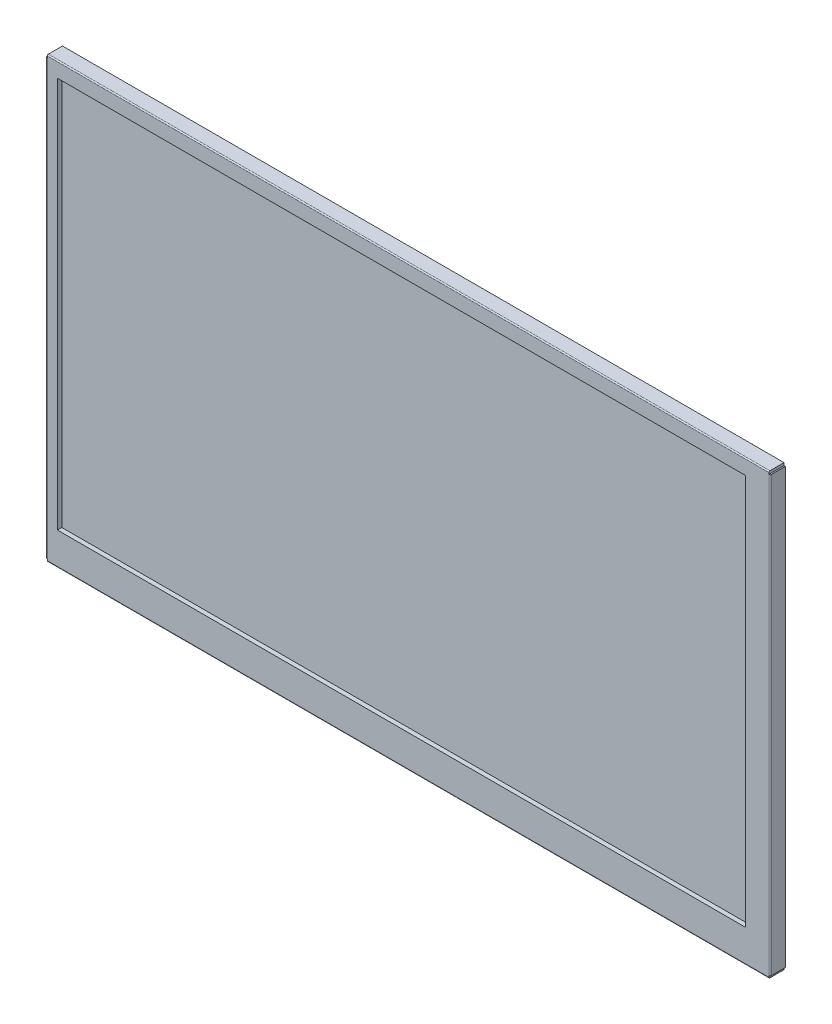
ISO-10303-21;
HEADER;
FILE_DESCRIPTION(('STEP AP214'),'2;1');
FILE_NAME('part.step','',(''),(''),'','','');
FILE_SCHEMA(('AUTOMOTIVE_DESIGN { 1 0 10303 214 1 1 1 1 }'));
ENDSEC;
DATA;
#1=APPLICATION_CONTEXT('core data for automotive mechanical design processes');
#2=APPLICATION_PROTOCOL_DEFINITION('international standard','automotive_design',2000,#1);
#3=PRODUCT_CONTEXT('',#1,'mechanical');
#4=PRODUCT('Part','Part','',(#3));
#5=PRODUCT_RELATED_PRODUCT_CATEGORY('part','',(#4));
#6=PRODUCT_DEFINITION_FORMATION('','',#4);
#7=PRODUCT_DEFINITION_CONTEXT('part definition',#1,'design');
#8=PRODUCT_DEFINITION('design','',#6,#7);
#9=PRODUCT_DEFINITION_SHAPE('','',#8);
#10=(LENGTH_UNIT() NAMED_UNIT(*) SI_UNIT(.MILLI.,.METRE.));
#11=(NAMED_UNIT(*) PLANE_ANGLE_UNIT() SI_UNIT($,.RADIAN.));
#12=(NAMED_UNIT(*) SI_UNIT($,.STERADIAN.) SOLID_ANGLE_UNIT());
#13=UNCERTAINTY_MEASURE_WITH_UNIT(LENGTH_MEASURE(1.E-05),#10,'distance_accuracy_value','');
#14=(GEOMETRIC_REPRESENTATION_CONTEXT(3) GLOBAL_UNCERTAINTY_ASSIGNED_CONTEXT((#13)) GLOBAL_UNIT_ASSIGNED_CONTEXT((#10,
#11,#12)) REPRESENTATION_CONTEXT('',''));
#15=CARTESIAN_POINT('',(0.,0.,0.));
#16=DIRECTION('',(0.,0.,1.));
#17=DIRECTION('',(1.,0.,0.));
#18=AXIS2_PLACEMENT_3D('',#15,#16,#17);
#19=CARTESIAN_POINT('',(-79.84,-42.57,2.45));
#20=DIRECTION('',(0.,0.,1.));
#21=DIRECTION('',(1.,0.,0.));
#22=AXIS2_PLACEMENT_3D('',#19,#20,#21);
#23=PLANE('',#22);
#24=DIRECTION('',(0.,1.,0.));
#25=VECTOR('',#24,1.);
#26=CARTESIAN_POINT('',(76.86,46.53,2.45));
#27=LINE('',#26,#25);
#28=CARTESIAN_POINT('',(76.86,-42.57,2.45));
#29=VERTEX_POINT('',#28);
#30=CARTESIAN_POINT('',(76.86,46.53,2.45));
#31=VERTEX_POINT('',#30);
#32=EDGE_CURVE('E259',#29,#31,#27,.T.);
#33=ORIENTED_EDGE('',*,*,#32,.T.);
#34=DIRECTION('',(1.,0.,0.));
#35=VECTOR('',#34,1.);
#36=CARTESIAN_POINT('',(-79.84,46.53,2.45));
#37=LINE('',#36,#35);
#38=CARTESIAN_POINT('',(-79.84,46.53,2.45));
#39=VERTEX_POINT('',#38);
#40=EDGE_CURVE('E265',#31,#39,#37,.F.);
#41=ORIENTED_EDGE('',*,*,#40,.T.);
#42=DIRECTION('',(0.,-1.,0.));
#43=VECTOR('',#42,1.);
#44=CARTESIAN_POINT('',(-79.84,46.53,2.45));
#45=LINE('',#44,#43);
#46=CARTESIAN_POINT('',(-79.84,-42.57,2.45));
#47=VERTEX_POINT('',#46);
#48=EDGE_CURVE('E268',#39,#47,#45,.T.);
#49=ORIENTED_EDGE('',*,*,#48,.T.);
#50=DIRECTION('',(1.,0.,0.));
#51=VECTOR('',#50,1.);
#52=CARTESIAN_POINT('',(-79.84,-42.57,2.45));
#53=LINE('',#52,#51);
#54=EDGE_CURVE('E250',#47,#29,#53,.T.);
#55=ORIENTED_EDGE('',*,*,#54,.T.);
#56=EDGE_LOOP('',(#33,#41,#49,#55));
#57=FACE_BOUND('',#56,.T.);
#58=ADVANCED_FACE('F16',(#57),#23,.T.);
#59=CARTESIAN_POINT('',(-79.84,46.53,2.45));
#60=DIRECTION('',(-1.,0.,0.));
#61=DIRECTION('',(0.,-1.,0.));
#62=AXIS2_PLACEMENT_3D('',#59,#60,#61);
#63=PLANE('',#62);
#64=DIRECTION('',(0.,0.,-1.));
#65=VECTOR('',#64,1.);
#66=CARTESIAN_POINT('',(-79.84,-42.57,2.45));
#67=LINE('',#66,#65);
#68=CARTESIAN_POINT('',(-79.84,-42.57,3.45));
#69=VERTEX_POINT('',#68);
#70=EDGE_CURVE('E253',#69,#47,#67,.T.);
#71=ORIENTED_EDGE('',*,*,#70,.T.);
#72=ORIENTED_EDGE('',*,*,#48,.F.);
#73=DIRECTION('',(0.,0.,1.));
#74=VECTOR('',#73,1.);
#75=CARTESIAN_POINT('',(-79.84,46.53,2.45));
#76=LINE('',#75,#74);
#77=CARTESIAN_POINT('',(-79.84,46.53,3.45));
#78=VERTEX_POINT('',#77);
#79=EDGE_CURVE('E262',#39,#78,#76,.T.);
#80=ORIENTED_EDGE('',*,*,#79,.T.);
#81=DIRECTION('',(0.,1.,0.));
#82=VECTOR('',#81,1.);
#83=CARTESIAN_POINT('',(-79.84,-50.,3.45));
#84=LINE('',#83,#82);
#85=EDGE_CURVE('E211',#69,#78,#84,.T.);
#86=ORIENTED_EDGE('',*,*,#85,.F.);
#87=EDGE_LOOP('',(#71,#72,#80,#86));
#88=FACE_BOUND('',#87,.T.);
#89=ADVANCED_FACE('F470',(#88),#63,.F.);
#90=CARTESIAN_POINT('',(-79.84,46.53,2.45));
#91=DIRECTION('',(0.,1.,0.));
#92=DIRECTION('',(0.,0.,1.));
#93=AXIS2_PLACEMENT_3D('',#90,#91,#92);
#94=PLANE('',#93);
#95=ORIENTED_EDGE('',*,*,#79,.F.);
#96=ORIENTED_EDGE('',*,*,#40,.F.);
#97=DIRECTION('',(0.,0.,-1.));
#98=VECTOR('',#97,1.);
#99=CARTESIAN_POINT('',(76.86,46.53,2.45));
#100=LINE('',#99,#98);
#101=CARTESIAN_POINT('',(76.86,46.53,3.45));
#102=VERTEX_POINT('',#101);
#103=EDGE_CURVE('E256',#31,#102,#100,.F.);
#104=ORIENTED_EDGE('',*,*,#103,.T.);
#105=DIRECTION('',(1.,0.,0.));
#106=VECTOR('',#105,1.);
#107=CARTESIAN_POINT('',(-82.45,46.53,3.45));
#108=LINE('',#107,#106);
#109=EDGE_CURVE('E209',#78,#102,#108,.T.);
#110=ORIENTED_EDGE('',*,*,#109,.F.);
#111=EDGE_LOOP('',(#95,#96,#104,#110));
#112=FACE_BOUND('',#111,.T.);
#113=ADVANCED_FACE('F467',(#112),#94,.F.);
#114=CARTESIAN_POINT('',(76.86,46.53,2.45));
#115=DIRECTION('',(1.,0.,0.));
#116=DIRECTION('',(0.,0.,-1.));
#117=AXIS2_PLACEMENT_3D('',#114,#115,#116);
#118=PLANE('',#117);
#119=ORIENTED_EDGE('',*,*,#103,.F.);
#120=ORIENTED_EDGE('',*,*,#32,.F.);
#121=DIRECTION('',(0.,0.,-1.));
#122=VECTOR('',#121,1.);
#123=CARTESIAN_POINT('',(76.8599999999999,-42.57,2.45));
#124=LINE('',#123,#122);
#125=CARTESIAN_POINT('',(76.86,-42.57,3.45));
#126=VERTEX_POINT('',#125);
#127=EDGE_CURVE('E214',#29,#126,#124,.F.);
#128=ORIENTED_EDGE('',*,*,#127,.T.);
#129=DIRECTION('',(0.,1.,0.));
#130=VECTOR('',#129,1.);
#131=CARTESIAN_POINT('',(76.8599999999999,-50.,3.45));
#132=LINE('',#131,#130);
#133=EDGE_CURVE('E207',#102,#126,#132,.F.);
#134=ORIENTED_EDGE('',*,*,#133,.F.);
#135=EDGE_LOOP('',(#119,#120,#128,#134));
#136=FACE_BOUND('',#135,.T.);
#137=ADVANCED_FACE('F463',(#136),#118,.F.);
#138=CARTESIAN_POINT('',(-79.84,-42.57,2.45));
#139=DIRECTION('',(0.,-1.,0.));
#140=DIRECTION('',(0.,0.,-1.));
#141=AXIS2_PLACEMENT_3D('',#138,#139,#140);
#142=PLANE('',#141);
#143=ORIENTED_EDGE('',*,*,#127,.F.);
#144=ORIENTED_EDGE('',*,*,#54,.F.);
#145=ORIENTED_EDGE('',*,*,#70,.F.);
#146=DIRECTION('',(1.,0.,0.));
#147=VECTOR('',#146,1.);
#148=CARTESIAN_POINT('',(-82.45,-42.57,3.45));
#149=LINE('',#148,#147);
#150=EDGE_CURVE('E194',#126,#69,#149,.F.);
#151=ORIENTED_EDGE('',*,*,#150,.F.);
#152=EDGE_LOOP('',(#143,#144,#145,#151));
#153=FACE_BOUND('',#152,.T.);
#154=ADVANCED_FACE('F459',(#153),#142,.F.);
#155=CARTESIAN_POINT('',(-82.45,-50.,3.45));
#156=DIRECTION('',(0.,0.,1.));
#157=DIRECTION('',(1.,0.,0.));
#158=AXIS2_PLACEMENT_3D('',#155,#156,#157);
#159=PLANE('',#158);
#160=ORIENTED_EDGE('',*,*,#133,.T.);
#161=ORIENTED_EDGE('',*,*,#150,.T.);
#162=ORIENTED_EDGE('',*,*,#85,.T.);
#163=ORIENTED_EDGE('',*,*,#109,.T.);
#164=EDGE_LOOP('',(#160,#161,#162,#163));
#165=FACE_BOUND('',#164,.T.);
#166=DIRECTION('',(-1.,0.,0.));
#167=VECTOR('',#166,1.);
#168=CARTESIAN_POINT('',(-82.45,-49.75,3.45));
#169=LINE('',#168,#167);
#170=CARTESIAN_POINT('',(82.15,-49.75,3.45));
#171=VERTEX_POINT('',#170);
#172=CARTESIAN_POINT('',(-82.15,-49.75,3.45));
#173=VERTEX_POINT('',#172);
#174=EDGE_CURVE('E236',#171,#173,#169,.T.);
#175=ORIENTED_EDGE('',*,*,#174,.F.);
#176=DIRECTION('',(0.,1.,0.));
#177=VECTOR('',#176,1.);
#178=CARTESIAN_POINT('',(82.15,-50.,3.45));
#179=LINE('',#178,#177);
#180=CARTESIAN_POINT('',(82.15,-49.4,3.45));
#181=VERTEX_POINT('',#180);
#182=EDGE_CURVE('E279',#171,#181,#179,.T.);
#183=ORIENTED_EDGE('',*,*,#182,.T.);
#184=DIRECTION('',(1.,0.,0.));
#185=VECTOR('',#184,1.);
#186=CARTESIAN_POINT('',(82.45,-49.4,3.45));
#187=LINE('',#186,#185);
#188=CARTESIAN_POINT('',(82.2,-49.4,3.45));
#189=VERTEX_POINT('',#188);
#190=EDGE_CURVE('E232',#181,#189,#187,.T.);
#191=ORIENTED_EDGE('',*,*,#190,.T.);
#192=DIRECTION('',(0.,-1.,0.));
#193=VECTOR('',#192,1.);
#194=CARTESIAN_POINT('',(82.2,-50.,3.45));
#195=LINE('',#194,#193);
#196=CARTESIAN_POINT('',(82.2,49.4,3.45));
#197=VERTEX_POINT('',#196);
#198=EDGE_CURVE('E224',#197,#189,#195,.T.);
#199=ORIENTED_EDGE('',*,*,#198,.F.);
#200=DIRECTION('',(1.,0.,0.));
#201=VECTOR('',#200,1.);
#202=CARTESIAN_POINT('',(82.45,49.4,3.45));
#203=LINE('',#202,#201);
#204=CARTESIAN_POINT('',(82.15,49.4,3.45));
#205=VERTEX_POINT('',#204);
#206=EDGE_CURVE('E274',#197,#205,#203,.F.);
#207=ORIENTED_EDGE('',*,*,#206,.T.);
#208=DIRECTION('',(0.,1.,0.));
#209=VECTOR('',#208,1.);
#210=CARTESIAN_POINT('',(82.15,50.,3.45));
#211=LINE('',#210,#209);
#212=CARTESIAN_POINT('',(82.15,49.75,3.45));
#213=VERTEX_POINT('',#212);
#214=EDGE_CURVE('E220',#205,#213,#211,.T.);
#215=ORIENTED_EDGE('',*,*,#214,.T.);
#216=DIRECTION('',(1.,0.,0.));
#217=VECTOR('',#216,1.);
#218=CARTESIAN_POINT('',(-82.45,49.75,3.45));
#219=LINE('',#218,#217);
#220=CARTESIAN_POINT('',(-82.15,49.75,3.45));
#221=VERTEX_POINT('',#220);
#222=EDGE_CURVE('E197',#221,#213,#219,.T.);
#223=ORIENTED_EDGE('',*,*,#222,.F.);
#224=DIRECTION('',(0.,1.,0.));
#225=VECTOR('',#224,1.);
#226=CARTESIAN_POINT('',(-82.15,-50.,3.45));
#227=LINE('',#226,#225);
#228=CARTESIAN_POINT('',(-82.15,49.4,3.45));
#229=VERTEX_POINT('',#228);
#230=EDGE_CURVE('E155',#221,#229,#227,.F.);
#231=ORIENTED_EDGE('',*,*,#230,.T.);
#232=DIRECTION('',(1.,0.,0.));
#233=VECTOR('',#232,1.);
#234=CARTESIAN_POINT('',(-82.45,49.4,3.45));
#235=LINE('',#234,#233);
#236=CARTESIAN_POINT('',(-82.2,49.4,3.45));
#237=VERTEX_POINT('',#236);
#238=EDGE_CURVE('E149',#229,#237,#235,.F.);
#239=ORIENTED_EDGE('',*,*,#238,.T.);
#240=DIRECTION('',(0.,1.,0.));
#241=VECTOR('',#240,1.);
#242=CARTESIAN_POINT('',(-82.2,-50.,3.45));
#243=LINE('',#242,#241);
#244=CARTESIAN_POINT('',(-82.2,-49.4,3.45));
#245=VERTEX_POINT('',#244);
#246=EDGE_CURVE('E152',#245,#237,#243,.T.);
#247=ORIENTED_EDGE('',*,*,#246,.F.);
#248=DIRECTION('',(1.,0.,0.));
#249=VECTOR('',#248,1.);
#250=CARTESIAN_POINT('',(-82.45,-49.4,3.45));
#251=LINE('',#250,#249);
#252=CARTESIAN_POINT('',(-82.15,-49.4,3.45));
#253=VERTEX_POINT('',#252);
#254=EDGE_CURVE('E280',#245,#253,#251,.T.);
#255=ORIENTED_EDGE('',*,*,#254,.T.);
#256=DIRECTION('',(0.,1.,0.));
#257=VECTOR('',#256,1.);
#258=CARTESIAN_POINT('',(-82.15,-50.,3.45));
#259=LINE('',#258,#257);
#260=EDGE_CURVE('E244',#253,#173,#259,.F.);
#261=ORIENTED_EDGE('',*,*,#260,.T.);
#262=EDGE_LOOP('',(#175,#183,#191,#199,#207,#215,#223,#231,#239,#247,#255,#261));
#263=FACE_BOUND('',#262,.T.);
#264=ADVANCED_FACE('F151',(#165,#263),#159,.T.);
#265=CARTESIAN_POINT('',(-82.45,49.4,0.));
#266=DIRECTION('',(0.,-1.,0.));
#267=DIRECTION('',(0.,0.,-1.));
#268=AXIS2_PLACEMENT_3D('',#265,#266,#267);
#269=PLANE('',#268);
#270=CARTESIAN_POINT('',(-82.2,49.4,3.2));
#271=DIRECTION('',(0.,1.,0.));
#272=DIRECTION('',(-1.,0.,0.));
#273=AXIS2_PLACEMENT_3D('',#270,#271,#272);
#274=CIRCLE('',#273,0.25);
#275=CARTESIAN_POINT('',(-82.45,49.4,3.2));
#276=VERTEX_POINT('',#275);
#277=EDGE_CURVE('E19',#237,#276,#274,.F.);
#278=ORIENTED_EDGE('',*,*,#277,.F.);
#279=ORIENTED_EDGE('',*,*,#238,.F.);
#280=DIRECTION('',(0.,0.,-1.));
#281=VECTOR('',#280,1.);
#282=CARTESIAN_POINT('',(-82.15,49.4,0.));
#283=LINE('',#282,#281);
#284=CARTESIAN_POINT('',(-82.15,49.4,0.));
#285=VERTEX_POINT('',#284);
#286=EDGE_CURVE('E200',#229,#285,#283,.T.);
#287=ORIENTED_EDGE('',*,*,#286,.T.);
#288=DIRECTION('',(1.,0.,0.));
#289=VECTOR('',#288,1.);
#290=CARTESIAN_POINT('',(-82.45,49.4,0.));
#291=LINE('',#290,#289);
#292=CARTESIAN_POINT('',(-82.45,49.4,0.));
#293=VERTEX_POINT('',#292);
#294=EDGE_CURVE('E160',#293,#285,#291,.T.);
#295=ORIENTED_EDGE('',*,*,#294,.F.);
#296=DIRECTION('',(0.,0.,1.));
#297=VECTOR('',#296,1.);
#298=CARTESIAN_POINT('',(-82.45,49.4,3.45));
#299=LINE('',#298,#297);
#300=EDGE_CURVE('E174',#293,#276,#299,.T.);
#301=ORIENTED_EDGE('',*,*,#300,.T.);
#302=EDGE_LOOP('',(#278,#279,#287,#295,#301));
#303=FACE_BOUND('',#302,.T.);
#304=ADVANCED_FACE('F172',(#303),#269,.F.);
#305=CARTESIAN_POINT('',(-82.2,-50.,3.2));
#306=DIRECTION('',(0.,1.,0.));
#307=DIRECTION('',(-1.,0.,0.));
#308=AXIS2_PLACEMENT_3D('',#305,#306,#307);
#309=CYLINDRICAL_SURFACE('',#308,0.25);
#310=CARTESIAN_POINT('',(-82.2,-49.4,3.2));
#311=DIRECTION('',(0.,1.,0.));
#312=DIRECTION('',(-1.,0.,0.));
#313=AXIS2_PLACEMENT_3D('',#310,#311,#312);
#314=CIRCLE('',#313,0.25);
#315=CARTESIAN_POINT('',(-82.45,-49.4,3.2));
#316=VERTEX_POINT('',#315);
#317=EDGE_CURVE('E168',#316,#245,#314,.T.);
#318=ORIENTED_EDGE('',*,*,#317,.T.);
#319=ORIENTED_EDGE('',*,*,#246,.T.);
#320=ORIENTED_EDGE('',*,*,#277,.T.);
#321=DIRECTION('',(0.,1.,0.));
#322=VECTOR('',#321,1.);
#323=CARTESIAN_POINT('',(-82.45,50.,3.2));
#324=LINE('',#323,#322);
#325=EDGE_CURVE('E178',#276,#316,#324,.F.);
#326=ORIENTED_EDGE('',*,*,#325,.T.);
#327=EDGE_LOOP('',(#318,#319,#320,#326));
#328=FACE_BOUND('',#327,.T.);
#329=ADVANCED_FACE('F165',(#328),#309,.T.);
#330=CARTESIAN_POINT('',(-82.45,-49.4,0.));
#331=DIRECTION('',(0.,1.,0.));
#332=DIRECTION('',(0.,0.,1.));
#333=AXIS2_PLACEMENT_3D('',#330,#331,#332);
#334=PLANE('',#333);
#335=ORIENTED_EDGE('',*,*,#317,.F.);
#336=DIRECTION('',(0.,0.,1.));
#337=VECTOR('',#336,1.);
#338=CARTESIAN_POINT('',(-82.45,-49.4,3.45));
#339=LINE('',#338,#337);
#340=CARTESIAN_POINT('',(-82.45,-49.4,0.));
#341=VERTEX_POINT('',#340);
#342=EDGE_CURVE('E181',#316,#341,#339,.F.);
#343=ORIENTED_EDGE('',*,*,#342,.T.);
#344=DIRECTION('',(1.,0.,0.));
#345=VECTOR('',#344,1.);
#346=CARTESIAN_POINT('',(-82.45,-49.4,0.));
#347=LINE('',#346,#345);
#348=CARTESIAN_POINT('',(-82.15,-49.4,0.));
#349=VERTEX_POINT('',#348);
#350=EDGE_CURVE('E169',#349,#341,#347,.F.);
#351=ORIENTED_EDGE('',*,*,#350,.F.);
#352=DIRECTION('',(0.,0.,-1.));
#353=VECTOR('',#352,1.);
#354=CARTESIAN_POINT('',(-82.15,-49.4,0.));
#355=LINE('',#354,#353);
#356=EDGE_CURVE('E241',#349,#253,#355,.F.);
#357=ORIENTED_EDGE('',*,*,#356,.T.);
#358=ORIENTED_EDGE('',*,*,#254,.F.);
#359=EDGE_LOOP('',(#335,#343,#351,#357,#358));
#360=FACE_BOUND('',#359,.T.);
#361=ADVANCED_FACE('F381',(#360),#334,.F.);
#362=CARTESIAN_POINT('',(-82.15,-50.,0.));
#363=DIRECTION('',(1.,0.,0.));
#364=DIRECTION('',(0.,0.,-1.));
#365=AXIS2_PLACEMENT_3D('',#362,#363,#364);
#366=PLANE('',#365);
#367=CARTESIAN_POINT('',(-82.15,-49.75,3.2));
#368=DIRECTION('',(-1.,0.,0.));
#369=DIRECTION('',(0.,0.,1.));
#370=AXIS2_PLACEMENT_3D('',#367,#368,#369);
#371=CIRCLE('',#370,0.25);
#372=CARTESIAN_POINT('',(-82.15,-50.,3.2));
#373=VERTEX_POINT('',#372);
#374=EDGE_CURVE('E240',#173,#373,#371,.F.);
#375=ORIENTED_EDGE('',*,*,#374,.F.);
#376=ORIENTED_EDGE('',*,*,#260,.F.);
#377=ORIENTED_EDGE('',*,*,#356,.F.);
#378=DIRECTION('',(0.,1.,0.));
#379=VECTOR('',#378,1.);
#380=CARTESIAN_POINT('',(-82.15,-50.,0.));
#381=LINE('',#380,#379);
#382=CARTESIAN_POINT('',(-82.15,-50.,0.));
#383=VERTEX_POINT('',#382);
#384=EDGE_CURVE('E245',#383,#349,#381,.T.);
#385=ORIENTED_EDGE('',*,*,#384,.F.);
#386=DIRECTION('',(0.,0.,1.));
#387=VECTOR('',#386,1.);
#388=CARTESIAN_POINT('',(-82.15,-50.,3.45));
#389=LINE('',#388,#387);
#390=EDGE_CURVE('E359',#383,#373,#389,.T.);
#391=ORIENTED_EDGE('',*,*,#390,.T.);
#392=EDGE_LOOP('',(#375,#376,#377,#385,#391));
#393=FACE_BOUND('',#392,.T.);
#394=ADVANCED_FACE('F437',(#393),#366,.F.);
#395=CARTESIAN_POINT('',(-82.45,-49.75,3.2));
#396=DIRECTION('',(-1.,0.,0.));
#397=DIRECTION('',(0.,0.,1.));
#398=AXIS2_PLACEMENT_3D('',#395,#396,#397);
#399=CYLINDRICAL_SURFACE('',#398,0.25);
#400=CARTESIAN_POINT('',(82.15,-49.75,3.2));
#401=DIRECTION('',(-1.,0.,0.));
#402=DIRECTION('',(0.,0.,1.));
#403=AXIS2_PLACEMENT_3D('',#400,#401,#402);
#404=CIRCLE('',#403,0.25);
#405=CARTESIAN_POINT('',(82.15,-50.,3.2));
#406=VERTEX_POINT('',#405);
#407=EDGE_CURVE('E276',#406,#171,#404,.T.);
#408=ORIENTED_EDGE('',*,*,#407,.T.);
#409=ORIENTED_EDGE('',*,*,#174,.T.);
#410=ORIENTED_EDGE('',*,*,#374,.T.);
#411=DIRECTION('',(1.,0.,0.));
#412=VECTOR('',#411,1.);
#413=CARTESIAN_POINT('',(-82.45,-50.,3.2));
#414=LINE('',#413,#412);
#415=EDGE_CURVE('E356',#373,#406,#414,.T.);
#416=ORIENTED_EDGE('',*,*,#415,.T.);
#417=EDGE_LOOP('',(#408,#409,#410,#416));
#418=FACE_BOUND('',#417,.T.);
#419=ADVANCED_FACE('F440',(#418),#399,.T.);
#420=CARTESIAN_POINT('',(82.15,-50.,0.));
#421=DIRECTION('',(-1.,0.,0.));
#422=DIRECTION('',(0.,0.,1.));
#423=AXIS2_PLACEMENT_3D('',#420,#421,#422);
#424=PLANE('',#423);
#425=ORIENTED_EDGE('',*,*,#407,.F.);
#426=DIRECTION('',(0.,0.,1.));
#427=VECTOR('',#426,1.);
#428=CARTESIAN_POINT('',(82.15,-50.,3.45));
#429=LINE('',#428,#427);
#430=CARTESIAN_POINT('',(82.15,-50.,0.));
#431=VERTEX_POINT('',#430);
#432=EDGE_CURVE('E343',#406,#431,#429,.F.);
#433=ORIENTED_EDGE('',*,*,#432,.T.);
#434=DIRECTION('',(0.,1.,0.));
#435=VECTOR('',#434,1.);
#436=CARTESIAN_POINT('',(82.15,-50.,0.));
#437=LINE('',#436,#435);
#438=CARTESIAN_POINT('',(82.15,-49.4,0.));
#439=VERTEX_POINT('',#438);
#440=EDGE_CURVE('E239',#439,#431,#437,.F.);
#441=ORIENTED_EDGE('',*,*,#440,.F.);
#442=DIRECTION('',(0.,0.,1.));
#443=VECTOR('',#442,1.);
#444=CARTESIAN_POINT('',(82.15,-49.4,0.));
#445=LINE('',#444,#443);
#446=EDGE_CURVE('E229',#439,#181,#445,.T.);
#447=ORIENTED_EDGE('',*,*,#446,.T.);
#448=ORIENTED_EDGE('',*,*,#182,.F.);
#449=EDGE_LOOP('',(#425,#433,#441,#447,#448));
#450=FACE_BOUND('',#449,.T.);
#451=ADVANCED_FACE('F431',(#450),#424,.F.);
#452=CARTESIAN_POINT('',(82.45,-49.4,0.));
#453=DIRECTION('',(0.,1.,0.));
#454=DIRECTION('',(0.,0.,1.));
#455=AXIS2_PLACEMENT_3D('',#452,#453,#454);
#456=PLANE('',#455);
#457=CARTESIAN_POINT('',(82.2,-49.4,3.2));
#458=DIRECTION('',(0.,-1.,0.));
#459=DIRECTION('',(1.,0.,0.));
#460=AXIS2_PLACEMENT_3D('',#457,#458,#459);
#461=CIRCLE('',#460,0.25);
#462=CARTESIAN_POINT('',(82.45,-49.4,3.2));
#463=VERTEX_POINT('',#462);
#464=EDGE_CURVE('E228',#189,#463,#461,.F.);
#465=ORIENTED_EDGE('',*,*,#464,.F.);
#466=ORIENTED_EDGE('',*,*,#190,.F.);
#467=ORIENTED_EDGE('',*,*,#446,.F.);
#468=DIRECTION('',(1.,0.,0.));
#469=VECTOR('',#468,1.);
#470=CARTESIAN_POINT('',(82.45,-49.4,0.));
#471=LINE('',#470,#469);
#472=CARTESIAN_POINT('',(82.45,-49.4,0.));
#473=VERTEX_POINT('',#472);
#474=EDGE_CURVE('E233',#473,#439,#471,.F.);
#475=ORIENTED_EDGE('',*,*,#474,.F.);
#476=DIRECTION('',(0.,0.,1.));
#477=VECTOR('',#476,1.);
#478=CARTESIAN_POINT('',(82.45,-49.4,3.45));
#479=LINE('',#478,#477);
#480=EDGE_CURVE('E329',#473,#463,#479,.T.);
#481=ORIENTED_EDGE('',*,*,#480,.T.);
#482=EDGE_LOOP('',(#465,#466,#467,#475,#481));
#483=FACE_BOUND('',#482,.T.);
#484=ADVANCED_FACE('F419',(#483),#456,.F.);
#485=CARTESIAN_POINT('',(82.2,-50.,3.2));
#486=DIRECTION('',(0.,-1.,0.));
#487=DIRECTION('',(1.,0.,0.));
#488=AXIS2_PLACEMENT_3D('',#485,#486,#487);
#489=CYLINDRICAL_SURFACE('',#488,0.25);
#490=CARTESIAN_POINT('',(82.2,49.4,3.2));
#491=DIRECTION('',(0.,-1.,0.));
#492=DIRECTION('',(1.,0.,0.));
#493=AXIS2_PLACEMENT_3D('',#490,#491,#492);
#494=CIRCLE('',#493,0.25);
#495=CARTESIAN_POINT('',(82.45,49.4,3.2));
#496=VERTEX_POINT('',#495);
#497=EDGE_CURVE('E271',#496,#197,#494,.T.);
#498=ORIENTED_EDGE('',*,*,#497,.T.);
#499=ORIENTED_EDGE('',*,*,#198,.T.);
#500=ORIENTED_EDGE('',*,*,#464,.T.);
#501=DIRECTION('',(0.,-1.,0.));
#502=VECTOR('',#501,1.);
#503=CARTESIAN_POINT('',(82.45,50.,3.2));
#504=LINE('',#503,#502);
#505=EDGE_CURVE('E326',#463,#496,#504,.F.);
#506=ORIENTED_EDGE('',*,*,#505,.T.);
#507=EDGE_LOOP('',(#498,#499,#500,#506));
#508=FACE_BOUND('',#507,.T.);
#509=ADVANCED_FACE('F427',(#508),#489,.T.);
#510=CARTESIAN_POINT('',(82.45,49.4,0.));
#511=DIRECTION('',(0.,-1.,0.));
#512=DIRECTION('',(0.,0.,-1.));
#513=AXIS2_PLACEMENT_3D('',#510,#511,#512);
#514=PLANE('',#513);
#515=ORIENTED_EDGE('',*,*,#497,.F.);
#516=DIRECTION('',(0.,0.,1.));
#517=VECTOR('',#516,1.);
#518=CARTESIAN_POINT('',(82.45,49.4,3.45));
#519=LINE('',#518,#517);
#520=CARTESIAN_POINT('',(82.45,49.4,0.));
#521=VERTEX_POINT('',#520);
#522=EDGE_CURVE('E313',#496,#521,#519,.F.);
#523=ORIENTED_EDGE('',*,*,#522,.T.);
#524=DIRECTION('',(1.,0.,0.));
#525=VECTOR('',#524,1.);
#526=CARTESIAN_POINT('',(82.45,49.4,0.));
#527=LINE('',#526,#525);
#528=CARTESIAN_POINT('',(82.15,49.4,0.));
#529=VERTEX_POINT('',#528);
#530=EDGE_CURVE('E227',#529,#521,#527,.T.);
#531=ORIENTED_EDGE('',*,*,#530,.F.);
#532=DIRECTION('',(0.,0.,1.));
#533=VECTOR('',#532,1.);
#534=CARTESIAN_POINT('',(82.15,49.4,0.));
#535=LINE('',#534,#533);
#536=EDGE_CURVE('E217',#529,#205,#535,.T.);
#537=ORIENTED_EDGE('',*,*,#536,.T.);
#538=ORIENTED_EDGE('',*,*,#206,.F.);
#539=EDGE_LOOP('',(#515,#523,#531,#537,#538));
#540=FACE_BOUND('',#539,.T.);
#541=ADVANCED_FACE('F425',(#540),#514,.F.);
#542=CARTESIAN_POINT('',(82.15,50.,0.));
#543=DIRECTION('',(-1.,0.,0.));
#544=DIRECTION('',(0.,0.,1.));
#545=AXIS2_PLACEMENT_3D('',#542,#543,#544);
#546=PLANE('',#545);
#547=CARTESIAN_POINT('',(82.15,49.75,3.2));
#548=DIRECTION('',(1.,0.,0.));
#549=DIRECTION('',(0.,0.,-1.));
#550=AXIS2_PLACEMENT_3D('',#547,#548,#549);
#551=CIRCLE('',#550,0.25);
#552=CARTESIAN_POINT('',(82.15,50.,3.2));
#553=VERTEX_POINT('',#552);
#554=EDGE_CURVE('E201',#213,#553,#551,.F.);
#555=ORIENTED_EDGE('',*,*,#554,.F.);
#556=ORIENTED_EDGE('',*,*,#214,.F.);
#557=ORIENTED_EDGE('',*,*,#536,.F.);
#558=DIRECTION('',(0.,1.,0.));
#559=VECTOR('',#558,1.);
#560=CARTESIAN_POINT('',(82.15,50.,0.));
#561=LINE('',#560,#559);
#562=CARTESIAN_POINT('',(82.15,50.,0.));
#563=VERTEX_POINT('',#562);
#564=EDGE_CURVE('E221',#563,#529,#561,.F.);
#565=ORIENTED_EDGE('',*,*,#564,.F.);
#566=DIRECTION('',(0.,0.,-1.));
#567=VECTOR('',#566,1.);
#568=CARTESIAN_POINT('',(82.15,50.,3.45));
#569=LINE('',#568,#567);
#570=EDGE_CURVE('E301',#563,#553,#569,.F.);
#571=ORIENTED_EDGE('',*,*,#570,.T.);
#572=EDGE_LOOP('',(#555,#556,#557,#565,#571));
#573=FACE_BOUND('',#572,.T.);
#574=ADVANCED_FACE('F614',(#573),#546,.F.);
#575=CARTESIAN_POINT('',(-82.45,49.75,3.2));
#576=DIRECTION('',(1.,0.,0.));
#577=DIRECTION('',(0.,0.,-1.));
#578=AXIS2_PLACEMENT_3D('',#575,#576,#577);
#579=CYLINDRICAL_SURFACE('',#578,0.25);
#580=CARTESIAN_POINT('',(-82.15,49.75,3.2));
#581=DIRECTION('',(1.,0.,0.));
#582=DIRECTION('',(0.,0.,-1.));
#583=AXIS2_PLACEMENT_3D('',#580,#581,#582);
#584=CIRCLE('',#583,0.25);
#585=CARTESIAN_POINT('',(-82.15,50.,3.2));
#586=VERTEX_POINT('',#585);
#587=EDGE_CURVE('E179',#586,#221,#584,.T.);
#588=ORIENTED_EDGE('',*,*,#587,.T.);
#589=ORIENTED_EDGE('',*,*,#222,.T.);
#590=ORIENTED_EDGE('',*,*,#554,.T.);
#591=DIRECTION('',(1.,0.,0.));
#592=VECTOR('',#591,1.);
#593=CARTESIAN_POINT('',(-82.45,50.,3.2));
#594=LINE('',#593,#592);
#595=EDGE_CURVE('E296',#553,#586,#594,.F.);
#596=ORIENTED_EDGE('',*,*,#595,.T.);
#597=EDGE_LOOP('',(#588,#589,#590,#596));
#598=FACE_BOUND('',#597,.T.);
#599=ADVANCED_FACE('F396',(#598),#579,.T.);
#600=CARTESIAN_POINT('',(-82.15,50.,0.));
#601=DIRECTION('',(1.,0.,0.));
#602=DIRECTION('',(0.,0.,-1.));
#603=AXIS2_PLACEMENT_3D('',#600,#601,#602);
#604=PLANE('',#603);
#605=ORIENTED_EDGE('',*,*,#587,.F.);
#606=DIRECTION('',(0.,0.,-1.));
#607=VECTOR('',#606,1.);
#608=CARTESIAN_POINT('',(-82.15,50.,3.45));
#609=LINE('',#608,#607);
#610=CARTESIAN_POINT('',(-82.15,50.,0.));
#611=VERTEX_POINT('',#610);
#612=EDGE_CURVE('E292',#586,#611,#609,.T.);
#613=ORIENTED_EDGE('',*,*,#612,.T.);
#614=DIRECTION('',(0.,1.,0.));
#615=VECTOR('',#614,1.);
#616=CARTESIAN_POINT('',(-82.15,50.,0.));
#617=LINE('',#616,#615);
#618=EDGE_CURVE('E34',#285,#611,#617,.T.);
#619=ORIENTED_EDGE('',*,*,#618,.F.);
#620=ORIENTED_EDGE('',*,*,#286,.F.);
#621=ORIENTED_EDGE('',*,*,#230,.F.);
#622=EDGE_LOOP('',(#605,#613,#619,#620,#621));
#623=FACE_BOUND('',#622,.T.);
#624=ADVANCED_FACE('F386',(#623),#604,.F.);
#625=CARTESIAN_POINT('',(-82.45,50.,3.45));
#626=DIRECTION('',(1.,0.,0.));
#627=DIRECTION('',(0.,1.,0.));
#628=AXIS2_PLACEMENT_3D('',#625,#626,#627);
#629=PLANE('',#628);
#630=ORIENTED_EDGE('',*,*,#325,.F.);
#631=ORIENTED_EDGE('',*,*,#300,.F.);
#632=DIRECTION('',(0.,1.,0.));
#633=VECTOR('',#632,1.);
#634=CARTESIAN_POINT('',(-82.45,-50.,0.));
#635=LINE('',#634,#633);
#636=EDGE_CURVE('E290',#293,#341,#635,.F.);
#637=ORIENTED_EDGE('',*,*,#636,.T.);
#638=ORIENTED_EDGE('',*,*,#342,.F.);
#639=EDGE_LOOP('',(#630,#631,#637,#638));
#640=FACE_BOUND('',#639,.T.);
#641=ADVANCED_FACE('F383',(#640),#629,.F.);
#642=CARTESIAN_POINT('',(-82.45,-50.,3.45));
#643=DIRECTION('',(0.,1.,0.));
#644=DIRECTION('',(0.,0.,1.));
#645=AXIS2_PLACEMENT_3D('',#642,#643,#644);
#646=PLANE('',#645);
#647=ORIENTED_EDGE('',*,*,#415,.F.);
#648=ORIENTED_EDGE('',*,*,#390,.F.);
#649=DIRECTION('',(1.,0.,0.));
#650=VECTOR('',#649,1.);
#651=CARTESIAN_POINT('',(-82.45,-50.,0.));
#652=LINE('',#651,#650);
#653=EDGE_CURVE('E291',#383,#431,#652,.T.);
#654=ORIENTED_EDGE('',*,*,#653,.T.);
#655=ORIENTED_EDGE('',*,*,#432,.F.);
#656=EDGE_LOOP('',(#647,#648,#654,#655));
#657=FACE_BOUND('',#656,.T.);
#658=ADVANCED_FACE('F385',(#657),#646,.F.);
#659=CARTESIAN_POINT('',(82.45,50.,3.45));
#660=DIRECTION('',(-1.,0.,0.));
#661=DIRECTION('',(0.,-1.,0.));
#662=AXIS2_PLACEMENT_3D('',#659,#660,#661);
#663=PLANE('',#662);
#664=ORIENTED_EDGE('',*,*,#505,.F.);
#665=ORIENTED_EDGE('',*,*,#480,.F.);
#666=DIRECTION('',(0.,1.,0.));
#667=VECTOR('',#666,1.);
#668=CARTESIAN_POINT('',(82.45,-50.,0.));
#669=LINE('',#668,#667);
#670=EDGE_CURVE('E25',#473,#521,#669,.T.);
#671=ORIENTED_EDGE('',*,*,#670,.T.);
#672=ORIENTED_EDGE('',*,*,#522,.F.);
#673=EDGE_LOOP('',(#664,#665,#671,#672));
#674=FACE_BOUND('',#673,.T.);
#675=ADVANCED_FACE('F393',(#674),#663,.F.);
#676=CARTESIAN_POINT('',(-82.45,50.,3.45));
#677=DIRECTION('',(0.,-1.,0.));
#678=DIRECTION('',(0.,0.,-1.));
#679=AXIS2_PLACEMENT_3D('',#676,#677,#678);
#680=PLANE('',#679);
#681=ORIENTED_EDGE('',*,*,#595,.F.);
#682=ORIENTED_EDGE('',*,*,#570,.F.);
#683=DIRECTION('',(1.,0.,0.));
#684=VECTOR('',#683,1.);
#685=CARTESIAN_POINT('',(-82.45,50.,0.));
#686=LINE('',#685,#684);
#687=EDGE_CURVE('E11',#563,#611,#686,.F.);
#688=ORIENTED_EDGE('',*,*,#687,.T.);
#689=ORIENTED_EDGE('',*,*,#612,.F.);
#690=EDGE_LOOP('',(#681,#682,#688,#689));
#691=FACE_BOUND('',#690,.T.);
#692=ADVANCED_FACE('F400',(#691),#680,.F.);
#693=CARTESIAN_POINT('',(-82.45,-50.,0.));
#694=DIRECTION('',(0.,0.,1.));
#695=DIRECTION('',(1.,0.,0.));
#696=AXIS2_PLACEMENT_3D('',#693,#694,#695);
#697=PLANE('',#696);
#698=ORIENTED_EDGE('',*,*,#618,.T.);
#699=ORIENTED_EDGE('',*,*,#687,.F.);
#700=ORIENTED_EDGE('',*,*,#564,.T.);
#701=ORIENTED_EDGE('',*,*,#530,.T.);
#702=ORIENTED_EDGE('',*,*,#670,.F.);
#703=ORIENTED_EDGE('',*,*,#474,.T.);
#704=ORIENTED_EDGE('',*,*,#440,.T.);
#705=ORIENTED_EDGE('',*,*,#653,.F.);
#706=ORIENTED_EDGE('',*,*,#384,.T.);
#707=ORIENTED_EDGE('',*,*,#350,.T.);
#708=ORIENTED_EDGE('',*,*,#636,.F.);
#709=ORIENTED_EDGE('',*,*,#294,.T.);
#710=EDGE_LOOP('',(#698,#699,#700,#701,#702,#703,#704,#705,#706,#707,#708,#709));
#711=FACE_BOUND('',#710,.T.);
#712=ADVANCED_FACE('F398',(#711),#697,.F.);
#713=CLOSED_SHELL('',(#58,#89,#113,#137,#154,#264,#304,#329,#361,#394,#419,#451,#484,#509,#541,
#574,#599,#624,#641,#658,#675,#692,#712));
#714=MANIFOLD_SOLID_BREP('B1',#713);
#715=ADVANCED_BREP_SHAPE_REPRESENTATION('',(#18,#714),#14);
#716=SHAPE_DEFINITION_REPRESENTATION(#9,#715);
ENDSEC;
END-ISO-10303-21;
